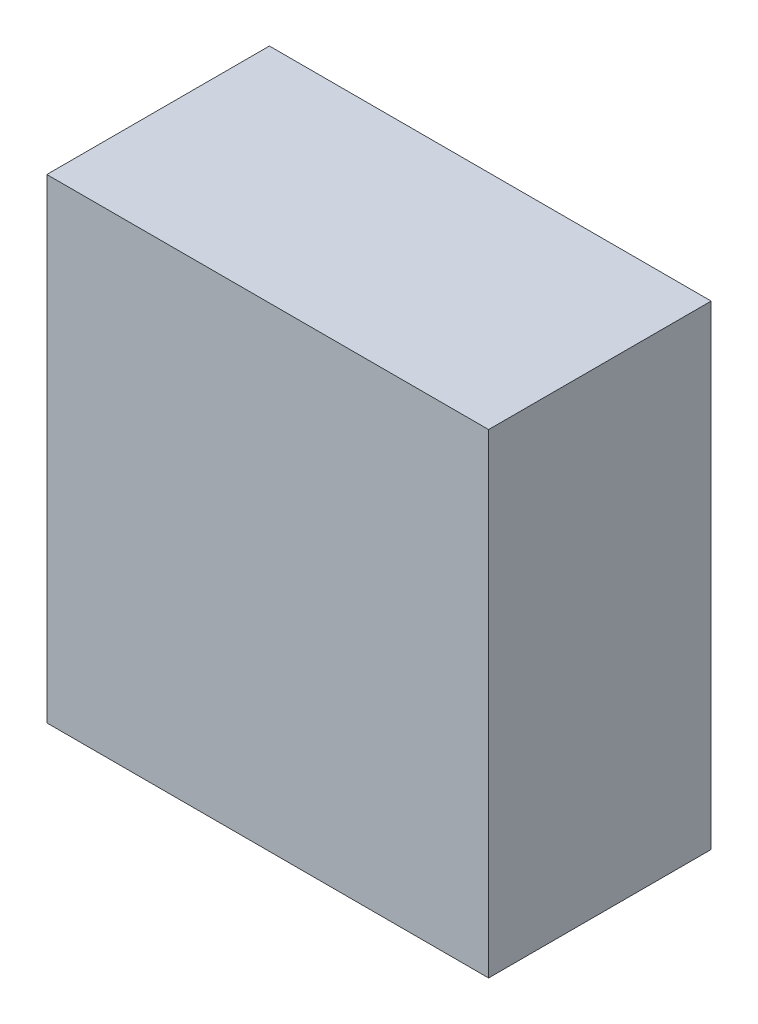
ISO-10303-21;
HEADER;
FILE_DESCRIPTION(('STEP AP214'),'2;1');
FILE_NAME('part.step','',(''),(''),'','','');
FILE_SCHEMA(('AUTOMOTIVE_DESIGN { 1 0 10303 214 1 1 1 1 }'));
ENDSEC;
DATA;
#1=APPLICATION_CONTEXT('core data for automotive mechanical design processes');
#2=APPLICATION_PROTOCOL_DEFINITION('international standard','automotive_design',2000,#1);
#3=PRODUCT_CONTEXT('',#1,'mechanical');
#4=PRODUCT('Part','Part','',(#3));
#5=PRODUCT_RELATED_PRODUCT_CATEGORY('part','',(#4));
#6=PRODUCT_DEFINITION_FORMATION('','',#4);
#7=PRODUCT_DEFINITION_CONTEXT('part definition',#1,'design');
#8=PRODUCT_DEFINITION('design','',#6,#7);
#9=PRODUCT_DEFINITION_SHAPE('','',#8);
#10=(LENGTH_UNIT() NAMED_UNIT(*) SI_UNIT(.MILLI.,.METRE.));
#11=(NAMED_UNIT(*) PLANE_ANGLE_UNIT() SI_UNIT($,.RADIAN.));
#12=(NAMED_UNIT(*) SI_UNIT($,.STERADIAN.) SOLID_ANGLE_UNIT());
#13=UNCERTAINTY_MEASURE_WITH_UNIT(LENGTH_MEASURE(1.E-05),#10,'distance_accuracy_value','');
#14=(GEOMETRIC_REPRESENTATION_CONTEXT(3) GLOBAL_UNCERTAINTY_ASSIGNED_CONTEXT((#13)) GLOBAL_UNIT_ASSIGNED_CONTEXT((#10,
#11,#12)) REPRESENTATION_CONTEXT('',''));
#15=CARTESIAN_POINT('',(0.,0.,0.));
#16=DIRECTION('',(0.,0.,1.));
#17=DIRECTION('',(1.,0.,0.));
#18=AXIS2_PLACEMENT_3D('',#15,#16,#17);
#19=CARTESIAN_POINT('',(-0.00667937524984511,-0.771801987569789,0.412208026250708));
#20=DIRECTION('',(0.,0.,1.));
#21=DIRECTION('',(1.,0.,0.));
#22=AXIS2_PLACEMENT_3D('',#19,#20,#21);
#23=PLANE('',#22);
#24=DIRECTION('',(0.,1.,0.));
#25=VECTOR('',#24,1.);
#26=CARTESIAN_POINT('',(0.086366618381998,-0.771801987569789,0.412208026250708));
#27=LINE('',#26,#25);
#28=CARTESIAN_POINT('',(0.086366618381998,-0.871837739395832,0.412208026250708));
#29=VERTEX_POINT('',#28);
#30=CARTESIAN_POINT('',(0.0863666183819827,-0.67176623574366,0.412208026250708));
#31=VERTEX_POINT('',#30);
#32=EDGE_CURVE('E11',#29,#31,#27,.T.);
#33=ORIENTED_EDGE('',*,*,#32,.F.);
#34=DIRECTION('',(1.,0.,0.));
#35=VECTOR('',#34,1.);
#36=CARTESIAN_POINT('',(-0.00667937524984511,-0.871837739395847,0.412208026250708));
#37=LINE('',#36,#35);
#38=CARTESIAN_POINT('',(-0.0997253688816018,-0.871837739395847,0.412208026250708));
#39=VERTEX_POINT('',#38);
#40=EDGE_CURVE('E23',#39,#29,#37,.T.);
#41=ORIENTED_EDGE('',*,*,#40,.F.);
#42=DIRECTION('',(0.,-1.,0.));
#43=VECTOR('',#42,1.);
#44=CARTESIAN_POINT('',(-0.099725368881617,-0.771801987569789,0.412208026250708));
#45=LINE('',#44,#43);
#46=CARTESIAN_POINT('',(-0.099725368881617,-0.671766235743674,0.412208026250708));
#47=VERTEX_POINT('',#46);
#48=EDGE_CURVE('E69',#47,#39,#45,.T.);
#49=ORIENTED_EDGE('',*,*,#48,.F.);
#50=DIRECTION('',(-1.,0.,0.));
#51=VECTOR('',#50,1.);
#52=CARTESIAN_POINT('',(-0.00667937524984511,-0.67176623574366,0.412208026250708));
#53=LINE('',#52,#51);
#54=EDGE_CURVE('E85',#31,#47,#53,.T.);
#55=ORIENTED_EDGE('',*,*,#54,.F.);
#56=EDGE_LOOP('',(#33,#41,#49,#55));
#57=FACE_BOUND('',#56,.T.);
#58=ADVANCED_FACE('F16',(#57),#23,.F.);
#59=CARTESIAN_POINT('',(0.0863666183819776,-0.67176623574366,0.474708026250708));
#60=DIRECTION('',(-1.01196828694583E-13,1.,0.));
#61=DIRECTION('',(-1.,-1.01196828694583E-13,0.));
#62=AXIS2_PLACEMENT_3D('',#59,#60,#61);
#63=PLANE('',#62);
#64=DIRECTION('',(1.,1.01196828694583E-13,0.));
#65=VECTOR('',#64,1.);
#66=CARTESIAN_POINT('',(0.0863666183819776,-0.67176623574366,0.505958026250708));
#67=LINE('',#66,#65);
#68=CARTESIAN_POINT('',(-0.099725368881617,-0.671766235743674,0.505958026250708));
#69=VERTEX_POINT('',#68);
#70=CARTESIAN_POINT('',(0.0863666183819878,-0.67176623574366,0.505958026250708));
#71=VERTEX_POINT('',#70);
#72=EDGE_CURVE('E72',#69,#71,#67,.T.);
#73=ORIENTED_EDGE('',*,*,#72,.T.);
#74=DIRECTION('',(0.,0.,-1.));
#75=VECTOR('',#74,1.);
#76=CARTESIAN_POINT('',(0.0863666183819776,-0.67176623574366,0.474708026250708));
#77=LINE('',#76,#75);
#78=EDGE_CURVE('E81',#71,#31,#77,.T.);
#79=ORIENTED_EDGE('',*,*,#78,.T.);
#80=ORIENTED_EDGE('',*,*,#54,.T.);
#81=DIRECTION('',(0.,0.,1.));
#82=VECTOR('',#81,1.);
#83=CARTESIAN_POINT('',(-0.099725368881617,-0.671766235743678,0.474708026250708));
#84=LINE('',#83,#82);
#85=EDGE_CURVE('E79',#47,#69,#84,.T.);
#86=ORIENTED_EDGE('',*,*,#85,.T.);
#87=EDGE_LOOP('',(#73,#79,#80,#86));
#88=FACE_BOUND('',#87,.T.);
#89=ADVANCED_FACE('F90',(#88),#63,.T.);
#90=CARTESIAN_POINT('',(0.086366618381998,-0.871837739395828,0.474708026250708));
#91=DIRECTION('',(1.,1.01196828694583E-13,0.));
#92=DIRECTION('',(-1.01196828694583E-13,1.,0.));
#93=AXIS2_PLACEMENT_3D('',#90,#91,#92);
#94=PLANE('',#93);
#95=ORIENTED_EDGE('',*,*,#32,.T.);
#96=ORIENTED_EDGE('',*,*,#78,.F.);
#97=DIRECTION('',(1.01196828694583E-13,-1.,0.));
#98=VECTOR('',#97,1.);
#99=CARTESIAN_POINT('',(0.086366618381998,-0.871837739395828,0.505958026250708));
#100=LINE('',#99,#98);
#101=CARTESIAN_POINT('',(0.086366618381998,-0.871837739395837,0.505958026250708));
#102=VERTEX_POINT('',#101);
#103=EDGE_CURVE('E77',#71,#102,#100,.T.);
#104=ORIENTED_EDGE('',*,*,#103,.T.);
#105=DIRECTION('',(0.,0.,-1.));
#106=VECTOR('',#105,1.);
#107=CARTESIAN_POINT('',(0.086366618381998,-0.871837739395828,0.474708026250708));
#108=LINE('',#107,#106);
#109=EDGE_CURVE('E58',#102,#29,#108,.T.);
#110=ORIENTED_EDGE('',*,*,#109,.T.);
#111=EDGE_LOOP('',(#95,#96,#104,#110));
#112=FACE_BOUND('',#111,.T.);
#113=ADVANCED_FACE('F88',(#112),#94,.T.);
#114=CARTESIAN_POINT('',(0.086366618381998,-0.871837739395828,0.474708026250708));
#115=DIRECTION('',(1.01196828694583E-13,-1.,0.));
#116=DIRECTION('',(1.,1.01196828694583E-13,0.));
#117=AXIS2_PLACEMENT_3D('',#114,#115,#116);
#118=PLANE('',#117);
#119=DIRECTION('',(-1.,-1.01196828694583E-13,0.));
#120=VECTOR('',#119,1.);
#121=CARTESIAN_POINT('',(0.086366618381998,-0.871837739395828,0.505958026250708));
#122=LINE('',#121,#120);
#123=CARTESIAN_POINT('',(-0.0997253688816069,-0.871837739395847,0.505958026250708));
#124=VERTEX_POINT('',#123);
#125=EDGE_CURVE('E54',#102,#124,#122,.T.);
#126=ORIENTED_EDGE('',*,*,#125,.T.);
#127=DIRECTION('',(0.,0.,-1.));
#128=VECTOR('',#127,1.);
#129=CARTESIAN_POINT('',(-0.0997253688815967,-0.871837739395847,0.474708026250708));
#130=LINE('',#129,#128);
#131=EDGE_CURVE('E57',#124,#39,#130,.T.);
#132=ORIENTED_EDGE('',*,*,#131,.T.);
#133=ORIENTED_EDGE('',*,*,#40,.T.);
#134=ORIENTED_EDGE('',*,*,#109,.F.);
#135=EDGE_LOOP('',(#126,#132,#133,#134));
#136=FACE_BOUND('',#135,.T.);
#137=ADVANCED_FACE('F56',(#136),#118,.T.);
#138=CARTESIAN_POINT('',(-0.099725368881617,-0.671766235743678,0.474708026250708));
#139=DIRECTION('',(-1.,-1.01196828694583E-13,0.));
#140=DIRECTION('',(1.01196828694583E-13,-1.,0.));
#141=AXIS2_PLACEMENT_3D('',#138,#139,#140);
#142=PLANE('',#141);
#143=DIRECTION('',(-1.01196828694583E-13,1.,0.));
#144=VECTOR('',#143,1.);
#145=CARTESIAN_POINT('',(-0.099725368881617,-0.671766235743678,0.505958026250708));
#146=LINE('',#145,#144);
#147=EDGE_CURVE('E68',#124,#69,#146,.T.);
#148=ORIENTED_EDGE('',*,*,#147,.T.);
#149=ORIENTED_EDGE('',*,*,#85,.F.);
#150=ORIENTED_EDGE('',*,*,#48,.T.);
#151=ORIENTED_EDGE('',*,*,#131,.F.);
#152=EDGE_LOOP('',(#148,#149,#150,#151));
#153=FACE_BOUND('',#152,.T.);
#154=ADVANCED_FACE('F66',(#153),#142,.T.);
#155=CARTESIAN_POINT('',(-0.00667937524984511,-0.771801987569789,0.505958026250708));
#156=DIRECTION('',(0.,0.,1.));
#157=DIRECTION('',(1.,0.,0.));
#158=AXIS2_PLACEMENT_3D('',#155,#156,#157);
#159=PLANE('',#158);
#160=ORIENTED_EDGE('',*,*,#103,.F.);
#161=ORIENTED_EDGE('',*,*,#72,.F.);
#162=ORIENTED_EDGE('',*,*,#147,.F.);
#163=ORIENTED_EDGE('',*,*,#125,.F.);
#164=EDGE_LOOP('',(#160,#161,#162,#163));
#165=FACE_BOUND('',#164,.T.);
#166=ADVANCED_FACE('F71',(#165),#159,.T.);
#167=CLOSED_SHELL('',(#58,#89,#113,#137,#154,#166));
#168=MANIFOLD_SOLID_BREP('B1',#167);
#169=ADVANCED_BREP_SHAPE_REPRESENTATION('',(#18,#168),#14);
#170=SHAPE_DEFINITION_REPRESENTATION(#9,#169);
ENDSEC;
END-ISO-10303-21;
